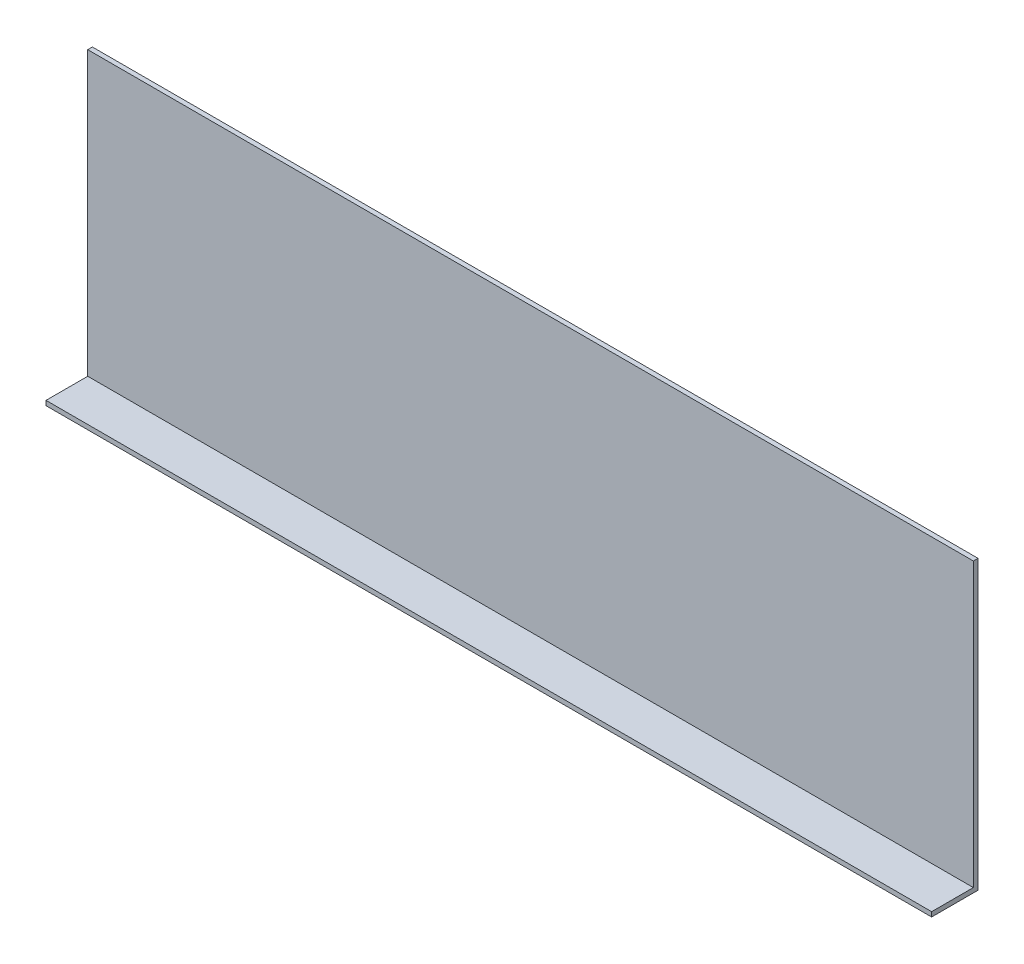
ISO-10303-21;
HEADER;
FILE_DESCRIPTION(('STEP AP214'),'2;1');
FILE_NAME('part.step','',(''),(''),'','','');
FILE_SCHEMA(('AUTOMOTIVE_DESIGN { 1 0 10303 214 1 1 1 1 }'));
ENDSEC;
DATA;
#1=APPLICATION_CONTEXT('core data for automotive mechanical design processes');
#2=APPLICATION_PROTOCOL_DEFINITION('international standard','automotive_design',2000,#1);
#3=PRODUCT_CONTEXT('',#1,'mechanical');
#4=PRODUCT('Part','Part','',(#3));
#5=PRODUCT_RELATED_PRODUCT_CATEGORY('part','',(#4));
#6=PRODUCT_DEFINITION_FORMATION('','',#4);
#7=PRODUCT_DEFINITION_CONTEXT('part definition',#1,'design');
#8=PRODUCT_DEFINITION('design','',#6,#7);
#9=PRODUCT_DEFINITION_SHAPE('','',#8);
#10=(LENGTH_UNIT() NAMED_UNIT(*) SI_UNIT(.MILLI.,.METRE.));
#11=(NAMED_UNIT(*) PLANE_ANGLE_UNIT() SI_UNIT($,.RADIAN.));
#12=(NAMED_UNIT(*) SI_UNIT($,.STERADIAN.) SOLID_ANGLE_UNIT());
#13=UNCERTAINTY_MEASURE_WITH_UNIT(LENGTH_MEASURE(1.E-05),#10,'distance_accuracy_value','');
#14=(GEOMETRIC_REPRESENTATION_CONTEXT(3) GLOBAL_UNCERTAINTY_ASSIGNED_CONTEXT((#13)) GLOBAL_UNIT_ASSIGNED_CONTEXT((#10,
#11,#12)) REPRESENTATION_CONTEXT('',''));
#15=CARTESIAN_POINT('',(0.,0.,0.));
#16=DIRECTION('',(0.,0.,1.));
#17=DIRECTION('',(1.,0.,0.));
#18=AXIS2_PLACEMENT_3D('',#15,#16,#17);
#19=CARTESIAN_POINT('',(0.,0.,5.));
#20=DIRECTION('',(0.,0.,-1.));
#21=DIRECTION('',(-1.,0.,0.));
#22=AXIS2_PLACEMENT_3D('',#19,#20,#21);
#23=PLANE('',#22);
#24=DIRECTION('',(-1.,0.,0.));
#25=VECTOR('',#24,1.);
#26=CARTESIAN_POINT('',(0.,-150.,5.));
#27=LINE('',#26,#25);
#28=CARTESIAN_POINT('',(477.5,-150.,5.));
#29=VERTEX_POINT('',#28);
#30=CARTESIAN_POINT('',(-477.5,-150.,5.));
#31=VERTEX_POINT('',#30);
#32=EDGE_CURVE('E50',#29,#31,#27,.T.);
#33=ORIENTED_EDGE('',*,*,#32,.F.);
#34=DIRECTION('',(0.,1.,0.));
#35=VECTOR('',#34,1.);
#36=CARTESIAN_POINT('',(477.5,-155.,5.));
#37=LINE('',#36,#35);
#38=CARTESIAN_POINT('',(477.5,155.,5.));
#39=VERTEX_POINT('',#38);
#40=EDGE_CURVE('E88',#29,#39,#37,.T.);
#41=ORIENTED_EDGE('',*,*,#40,.T.);
#42=DIRECTION('',(-1.,0.,0.));
#43=VECTOR('',#42,1.);
#44=CARTESIAN_POINT('',(-477.5,155.,5.));
#45=LINE('',#44,#43);
#46=CARTESIAN_POINT('',(-477.5,155.,5.));
#47=VERTEX_POINT('',#46);
#48=EDGE_CURVE('E56',#39,#47,#45,.T.);
#49=ORIENTED_EDGE('',*,*,#48,.T.);
#50=DIRECTION('',(0.,-1.,0.));
#51=VECTOR('',#50,1.);
#52=CARTESIAN_POINT('',(-477.5,-155.,5.));
#53=LINE('',#52,#51);
#54=EDGE_CURVE('E99',#47,#31,#53,.T.);
#55=ORIENTED_EDGE('',*,*,#54,.T.);
#56=EDGE_LOOP('',(#33,#41,#49,#55));
#57=FACE_BOUND('',#56,.T.);
#58=ADVANCED_FACE('F35',(#57),#23,.F.);
#59=CARTESIAN_POINT('',(477.5,-155.,5.));
#60=DIRECTION('',(-1.,0.,0.));
#61=DIRECTION('',(0.,0.,1.));
#62=AXIS2_PLACEMENT_3D('',#59,#60,#61);
#63=PLANE('',#62);
#64=DIRECTION('',(0.,1.,0.));
#65=VECTOR('',#64,1.);
#66=CARTESIAN_POINT('',(477.5,-155.,0.));
#67=LINE('',#66,#65);
#68=CARTESIAN_POINT('',(477.5,-155.,0.));
#69=VERTEX_POINT('',#68);
#70=CARTESIAN_POINT('',(477.5,155.,0.));
#71=VERTEX_POINT('',#70);
#72=EDGE_CURVE('E95',#69,#71,#67,.T.);
#73=ORIENTED_EDGE('',*,*,#72,.T.);
#74=DIRECTION('',(0.,0.,-1.));
#75=VECTOR('',#74,1.);
#76=CARTESIAN_POINT('',(477.5,155.,5.));
#77=LINE('',#76,#75);
#78=EDGE_CURVE('E11',#39,#71,#77,.T.);
#79=ORIENTED_EDGE('',*,*,#78,.F.);
#80=ORIENTED_EDGE('',*,*,#40,.F.);
#81=DIRECTION('',(0.,0.,-1.));
#82=VECTOR('',#81,1.);
#83=CARTESIAN_POINT('',(477.5,-150.,50.));
#84=LINE('',#83,#82);
#85=CARTESIAN_POINT('',(477.5,-150.,50.));
#86=VERTEX_POINT('',#85);
#87=EDGE_CURVE('E107',#86,#29,#84,.T.);
#88=ORIENTED_EDGE('',*,*,#87,.F.);
#89=DIRECTION('',(0.,1.,0.));
#90=VECTOR('',#89,1.);
#91=CARTESIAN_POINT('',(477.5,0.,50.));
#92=LINE('',#91,#90);
#93=CARTESIAN_POINT('',(477.5,-155.,50.));
#94=VERTEX_POINT('',#93);
#95=EDGE_CURVE('E98',#94,#86,#92,.T.);
#96=ORIENTED_EDGE('',*,*,#95,.F.);
#97=DIRECTION('',(0.,0.,-1.));
#98=VECTOR('',#97,1.);
#99=CARTESIAN_POINT('',(477.5,-155.,5.));
#100=LINE('',#99,#98);
#101=EDGE_CURVE('E81',#94,#69,#100,.T.);
#102=ORIENTED_EDGE('',*,*,#101,.T.);
#103=EDGE_LOOP('',(#73,#79,#80,#88,#96,#102));
#104=FACE_BOUND('',#103,.T.);
#105=ADVANCED_FACE('F37',(#104),#63,.F.);
#106=CARTESIAN_POINT('',(-477.5,155.,5.));
#107=DIRECTION('',(0.,-1.,0.));
#108=DIRECTION('',(0.,0.,-1.));
#109=AXIS2_PLACEMENT_3D('',#106,#107,#108);
#110=PLANE('',#109);
#111=DIRECTION('',(-1.,0.,0.));
#112=VECTOR('',#111,1.);
#113=CARTESIAN_POINT('',(-477.5,155.,0.));
#114=LINE('',#113,#112);
#115=CARTESIAN_POINT('',(-477.5,155.,0.));
#116=VERTEX_POINT('',#115);
#117=EDGE_CURVE('E102',#71,#116,#114,.T.);
#118=ORIENTED_EDGE('',*,*,#117,.T.);
#119=DIRECTION('',(0.,0.,-1.));
#120=VECTOR('',#119,1.);
#121=CARTESIAN_POINT('',(-477.5,155.,5.));
#122=LINE('',#121,#120);
#123=EDGE_CURVE('E43',#47,#116,#122,.T.);
#124=ORIENTED_EDGE('',*,*,#123,.F.);
#125=ORIENTED_EDGE('',*,*,#48,.F.);
#126=ORIENTED_EDGE('',*,*,#78,.T.);
#127=EDGE_LOOP('',(#118,#124,#125,#126));
#128=FACE_BOUND('',#127,.T.);
#129=ADVANCED_FACE('F118',(#128),#110,.F.);
#130=CARTESIAN_POINT('',(-477.5,-155.,5.));
#131=DIRECTION('',(1.,0.,0.));
#132=DIRECTION('',(0.,0.,-1.));
#133=AXIS2_PLACEMENT_3D('',#130,#131,#132);
#134=PLANE('',#133);
#135=DIRECTION('',(0.,-1.,0.));
#136=VECTOR('',#135,1.);
#137=CARTESIAN_POINT('',(-477.5,-155.,0.));
#138=LINE('',#137,#136);
#139=CARTESIAN_POINT('',(-477.5,-155.,0.));
#140=VERTEX_POINT('',#139);
#141=EDGE_CURVE('E89',#116,#140,#138,.T.);
#142=ORIENTED_EDGE('',*,*,#141,.T.);
#143=DIRECTION('',(0.,0.,-1.));
#144=VECTOR('',#143,1.);
#145=CARTESIAN_POINT('',(-477.5,-155.,5.));
#146=LINE('',#145,#144);
#147=CARTESIAN_POINT('',(-477.5,-155.,50.));
#148=VERTEX_POINT('',#147);
#149=EDGE_CURVE('E84',#148,#140,#146,.T.);
#150=ORIENTED_EDGE('',*,*,#149,.F.);
#151=DIRECTION('',(0.,-1.,0.));
#152=VECTOR('',#151,1.);
#153=CARTESIAN_POINT('',(-477.5,0.,50.));
#154=LINE('',#153,#152);
#155=CARTESIAN_POINT('',(-477.5,-150.,50.));
#156=VERTEX_POINT('',#155);
#157=EDGE_CURVE('E135',#156,#148,#154,.T.);
#158=ORIENTED_EDGE('',*,*,#157,.F.);
#159=DIRECTION('',(0.,0.,-1.));
#160=VECTOR('',#159,1.);
#161=CARTESIAN_POINT('',(-477.5,-150.,50.));
#162=LINE('',#161,#160);
#163=EDGE_CURVE('E103',#156,#31,#162,.T.);
#164=ORIENTED_EDGE('',*,*,#163,.T.);
#165=ORIENTED_EDGE('',*,*,#54,.F.);
#166=ORIENTED_EDGE('',*,*,#123,.T.);
#167=EDGE_LOOP('',(#142,#150,#158,#164,#165,#166));
#168=FACE_BOUND('',#167,.T.);
#169=ADVANCED_FACE('F116',(#168),#134,.F.);
#170=CARTESIAN_POINT('',(-477.5,-155.,5.));
#171=DIRECTION('',(0.,1.,0.));
#172=DIRECTION('',(0.,0.,1.));
#173=AXIS2_PLACEMENT_3D('',#170,#171,#172);
#174=PLANE('',#173);
#175=DIRECTION('',(1.,0.,0.));
#176=VECTOR('',#175,1.);
#177=CARTESIAN_POINT('',(-477.5,-155.,0.));
#178=LINE('',#177,#176);
#179=EDGE_CURVE('E76',#140,#69,#178,.T.);
#180=ORIENTED_EDGE('',*,*,#179,.T.);
#181=ORIENTED_EDGE('',*,*,#101,.F.);
#182=DIRECTION('',(1.,0.,0.));
#183=VECTOR('',#182,1.);
#184=CARTESIAN_POINT('',(0.,-155.,50.));
#185=LINE('',#184,#183);
#186=EDGE_CURVE('E129',#148,#94,#185,.T.);
#187=ORIENTED_EDGE('',*,*,#186,.F.);
#188=ORIENTED_EDGE('',*,*,#149,.T.);
#189=EDGE_LOOP('',(#180,#181,#187,#188));
#190=FACE_BOUND('',#189,.T.);
#191=ADVANCED_FACE('F78',(#190),#174,.F.);
#192=CARTESIAN_POINT('',(0.,0.,0.));
#193=DIRECTION('',(0.,0.,-1.));
#194=DIRECTION('',(-1.,0.,0.));
#195=AXIS2_PLACEMENT_3D('',#192,#193,#194);
#196=PLANE('',#195);
#197=ORIENTED_EDGE('',*,*,#72,.F.);
#198=ORIENTED_EDGE('',*,*,#179,.F.);
#199=ORIENTED_EDGE('',*,*,#141,.F.);
#200=ORIENTED_EDGE('',*,*,#117,.F.);
#201=EDGE_LOOP('',(#197,#198,#199,#200));
#202=FACE_BOUND('',#201,.T.);
#203=ADVANCED_FACE('F101',(#202),#196,.T.);
#204=CARTESIAN_POINT('',(0.,-150.,50.));
#205=DIRECTION('',(0.,-1.,0.));
#206=DIRECTION('',(0.,0.,-1.));
#207=AXIS2_PLACEMENT_3D('',#204,#205,#206);
#208=PLANE('',#207);
#209=ORIENTED_EDGE('',*,*,#32,.T.);
#210=ORIENTED_EDGE('',*,*,#163,.F.);
#211=DIRECTION('',(-1.,0.,0.));
#212=VECTOR('',#211,1.);
#213=CARTESIAN_POINT('',(0.,-150.,50.));
#214=LINE('',#213,#212);
#215=EDGE_CURVE('E127',#86,#156,#214,.T.);
#216=ORIENTED_EDGE('',*,*,#215,.F.);
#217=ORIENTED_EDGE('',*,*,#87,.T.);
#218=EDGE_LOOP('',(#209,#210,#216,#217));
#219=FACE_BOUND('',#218,.T.);
#220=ADVANCED_FACE('F123',(#219),#208,.F.);
#221=CARTESIAN_POINT('',(0.,0.,50.));
#222=DIRECTION('',(0.,0.,1.));
#223=DIRECTION('',(1.,0.,0.));
#224=AXIS2_PLACEMENT_3D('',#221,#222,#223);
#225=PLANE('',#224);
#226=ORIENTED_EDGE('',*,*,#215,.T.);
#227=ORIENTED_EDGE('',*,*,#157,.T.);
#228=ORIENTED_EDGE('',*,*,#186,.T.);
#229=ORIENTED_EDGE('',*,*,#95,.T.);
#230=EDGE_LOOP('',(#226,#227,#228,#229));
#231=FACE_BOUND('',#230,.T.);
#232=ADVANCED_FACE('F142',(#231),#225,.T.);
#233=CLOSED_SHELL('',(#58,#105,#129,#169,#191,#203,#220,#232));
#234=MANIFOLD_SOLID_BREP('B2',#233);
#235=ADVANCED_BREP_SHAPE_REPRESENTATION('',(#18,#234),#14);
#236=SHAPE_DEFINITION_REPRESENTATION(#9,#235);
ENDSEC;
END-ISO-10303-21;
